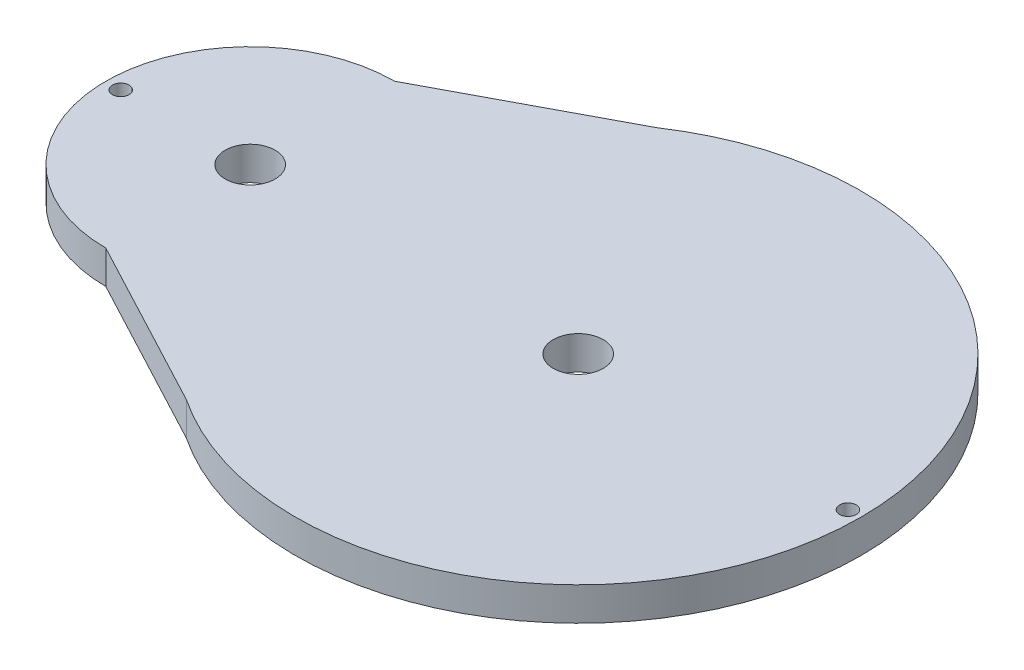
ISO-10303-21;
HEADER;
FILE_DESCRIPTION(('STEP AP214'),'2;1');
FILE_NAME('part.step','',(''),(''),'','','');
FILE_SCHEMA(('AUTOMOTIVE_DESIGN { 1 0 10303 214 1 1 1 1 }'));
ENDSEC;
DATA;
#1=APPLICATION_CONTEXT('core data for automotive mechanical design processes');
#2=APPLICATION_PROTOCOL_DEFINITION('international standard','automotive_design',2000,#1);
#3=PRODUCT_CONTEXT('',#1,'mechanical');
#4=PRODUCT('Part','Part','',(#3));
#5=PRODUCT_RELATED_PRODUCT_CATEGORY('part','',(#4));
#6=PRODUCT_DEFINITION_FORMATION('','',#4);
#7=PRODUCT_DEFINITION_CONTEXT('part definition',#1,'design');
#8=PRODUCT_DEFINITION('design','',#6,#7);
#9=PRODUCT_DEFINITION_SHAPE('','',#8);
#10=(LENGTH_UNIT() NAMED_UNIT(*) SI_UNIT(.MILLI.,.METRE.));
#11=(NAMED_UNIT(*) PLANE_ANGLE_UNIT() SI_UNIT($,.RADIAN.));
#12=(NAMED_UNIT(*) SI_UNIT($,.STERADIAN.) SOLID_ANGLE_UNIT());
#13=UNCERTAINTY_MEASURE_WITH_UNIT(LENGTH_MEASURE(1.E-05),#10,'distance_accuracy_value','');
#14=(GEOMETRIC_REPRESENTATION_CONTEXT(3) GLOBAL_UNCERTAINTY_ASSIGNED_CONTEXT((#13)) GLOBAL_UNIT_ASSIGNED_CONTEXT((#10,
#11,#12)) REPRESENTATION_CONTEXT('',''));
#15=CARTESIAN_POINT('',(0.,0.,0.));
#16=DIRECTION('',(0.,0.,1.));
#17=DIRECTION('',(1.,0.,0.));
#18=AXIS2_PLACEMENT_3D('',#15,#16,#17);
#19=CARTESIAN_POINT('',(31.9089246812045,6.,-7.07485149033878));
#20=DIRECTION('',(0.,-1.,0.));
#21=DIRECTION('',(0.,0.,-1.));
#22=AXIS2_PLACEMENT_3D('',#19,#20,#21);
#23=CYLINDRICAL_SURFACE('',#22,50.89);
#24=CARTESIAN_POINT('',(31.9089246812045,0.,-7.07485149033878));
#25=DIRECTION('',(0.,1.,0.));
#26=DIRECTION('',(0.,0.,1.));
#27=AXIS2_PLACEMENT_3D('',#24,#25,#26);
#28=CIRCLE('',#27,50.89);
#29=CARTESIAN_POINT('',(3.70624919259435,0.,35.2855214457456));
#30=VERTEX_POINT('',#29);
#31=CARTESIAN_POINT('',(3.70624919259435,0.,-49.4352244264231));
#32=VERTEX_POINT('',#31);
#33=EDGE_CURVE('E109',#30,#32,#28,.T.);
#34=ORIENTED_EDGE('',*,*,#33,.T.);
#35=DIRECTION('',(0.,-1.,0.));
#36=VECTOR('',#35,1.);
#37=CARTESIAN_POINT('',(3.70624919259435,6.,-49.4352244264231));
#38=LINE('',#37,#36);
#39=CARTESIAN_POINT('',(3.70624919259435,6.,-49.4352244264231));
#40=VERTEX_POINT('',#39);
#41=EDGE_CURVE('E11',#40,#32,#38,.T.);
#42=ORIENTED_EDGE('',*,*,#41,.F.);
#43=CARTESIAN_POINT('',(31.9089246812045,6.,-7.07485149033878));
#44=DIRECTION('',(0.,1.,0.));
#45=DIRECTION('',(0.,0.,1.));
#46=AXIS2_PLACEMENT_3D('',#43,#44,#45);
#47=CIRCLE('',#46,50.89);
#48=CARTESIAN_POINT('',(3.70624919259435,6.,35.2855214457456));
#49=VERTEX_POINT('',#48);
#50=EDGE_CURVE('E78',#49,#40,#47,.T.);
#51=ORIENTED_EDGE('',*,*,#50,.F.);
#52=DIRECTION('',(0.,-1.,0.));
#53=VECTOR('',#52,1.);
#54=CARTESIAN_POINT('',(3.70624919259435,6.,35.2855214457456));
#55=LINE('',#54,#53);
#56=EDGE_CURVE('E108',#49,#30,#55,.T.);
#57=ORIENTED_EDGE('',*,*,#56,.T.);
#58=EDGE_LOOP('',(#34,#42,#51,#57));
#59=FACE_BOUND('',#58,.T.);
#60=ADVANCED_FACE('F37',(#59),#23,.T.);
#61=CARTESIAN_POINT('',(-19.6475087974022,6.,-37.051191902898));
#62=DIRECTION('',(-0.468486800461283,0.,-0.883470496277917));
#63=DIRECTION('',(-0.883470496277917,0.,0.468486800461283));
#64=AXIS2_PLACEMENT_3D('',#61,#62,#63);
#65=PLANE('',#64);
#66=DIRECTION('',(0.883470496277917,0.,-0.468486800461283));
#67=VECTOR('',#66,1.);
#68=CARTESIAN_POINT('',(-19.6475087974022,0.,-37.051191902898));
#69=LINE('',#68,#67);
#70=CARTESIAN_POINT('',(-27.1460753187955,0.,-33.0748514903388));
#71=VERTEX_POINT('',#70);
#72=EDGE_CURVE('E87',#71,#32,#69,.T.);
#73=ORIENTED_EDGE('',*,*,#72,.F.);
#74=DIRECTION('',(0.,-1.,0.));
#75=VECTOR('',#74,1.);
#76=CARTESIAN_POINT('',(-27.1460753187955,6.,-33.0748514903388));
#77=LINE('',#76,#75);
#78=CARTESIAN_POINT('',(-27.1460753187955,6.,-33.0748514903388));
#79=VERTEX_POINT('',#78);
#80=EDGE_CURVE('E46',#79,#71,#77,.T.);
#81=ORIENTED_EDGE('',*,*,#80,.F.);
#82=DIRECTION('',(0.883470496277917,0.,-0.468486800461283));
#83=VECTOR('',#82,1.);
#84=CARTESIAN_POINT('',(-19.6475087974022,6.,-37.051191902898));
#85=LINE('',#84,#83);
#86=EDGE_CURVE('E85',#79,#40,#85,.T.);
#87=ORIENTED_EDGE('',*,*,#86,.T.);
#88=ORIENTED_EDGE('',*,*,#41,.T.);
#89=EDGE_LOOP('',(#73,#81,#87,#88));
#90=FACE_BOUND('',#89,.T.);
#91=ADVANCED_FACE('F84',(#90),#65,.T.);
#92=CARTESIAN_POINT('',(-27.1460753187955,6.,-7.07485149033878));
#93=DIRECTION('',(0.,-1.,0.));
#94=DIRECTION('',(0.,0.,-1.));
#95=AXIS2_PLACEMENT_3D('',#92,#93,#94);
#96=CYLINDRICAL_SURFACE('',#95,26.);
#97=CARTESIAN_POINT('',(-27.1460753187955,0.,-7.07485149033878));
#98=DIRECTION('',(0.,1.,0.));
#99=DIRECTION('',(0.,0.,1.));
#100=AXIS2_PLACEMENT_3D('',#97,#98,#99);
#101=CIRCLE('',#100,26.);
#102=CARTESIAN_POINT('',(-27.1460753187955,0.,18.9251485096612));
#103=VERTEX_POINT('',#102);
#104=EDGE_CURVE('E113',#103,#71,#101,.F.);
#105=ORIENTED_EDGE('',*,*,#104,.F.);
#106=DIRECTION('',(0.,-1.,0.));
#107=VECTOR('',#106,1.);
#108=CARTESIAN_POINT('',(-27.1460753187955,6.,18.9251485096612));
#109=LINE('',#108,#107);
#110=CARTESIAN_POINT('',(-27.1460753187955,6.,18.9251485096612));
#111=VERTEX_POINT('',#110);
#112=EDGE_CURVE('E70',#111,#103,#109,.T.);
#113=ORIENTED_EDGE('',*,*,#112,.F.);
#114=CARTESIAN_POINT('',(-27.1460753187955,6.,-7.07485149033878));
#115=DIRECTION('',(0.,1.,0.));
#116=DIRECTION('',(0.,0.,1.));
#117=AXIS2_PLACEMENT_3D('',#114,#115,#116);
#118=CIRCLE('',#117,26.);
#119=EDGE_CURVE('E95',#111,#79,#118,.F.);
#120=ORIENTED_EDGE('',*,*,#119,.T.);
#121=ORIENTED_EDGE('',*,*,#80,.T.);
#122=EDGE_LOOP('',(#105,#113,#120,#121));
#123=FACE_BOUND('',#122,.T.);
#124=ADVANCED_FACE('F97',(#123),#96,.T.);
#125=CARTESIAN_POINT('',(-27.1460753187955,6.,-7.07485149033878));
#126=DIRECTION('',(0.,-1.,0.));
#127=DIRECTION('',(0.,0.,-1.));
#128=AXIS2_PLACEMENT_3D('',#125,#126,#127);
#129=CYLINDRICAL_SURFACE('',#128,4.5);
#130=CARTESIAN_POINT('',(-27.1460753187955,6.,-7.07485149033878));
#131=DIRECTION('',(0.,1.,0.));
#132=DIRECTION('',(0.,0.,1.));
#133=AXIS2_PLACEMENT_3D('',#130,#131,#132);
#134=CIRCLE('',#133,4.5);
#135=CARTESIAN_POINT('',(-27.1460753187955,6.,-2.57485149033878));
#136=VERTEX_POINT('',#135);
#137=EDGE_CURVE('E99',#136,#136,#134,.T.);
#138=ORIENTED_EDGE('',*,*,#137,.T.);
#139=EDGE_LOOP('',(#138));
#140=FACE_BOUND('',#139,.T.);
#141=CARTESIAN_POINT('',(-27.1460753187955,0.,-7.07485149033878));
#142=DIRECTION('',(0.,1.,0.));
#143=DIRECTION('',(0.,0.,1.));
#144=AXIS2_PLACEMENT_3D('',#141,#142,#143);
#145=CIRCLE('',#144,4.5);
#146=CARTESIAN_POINT('',(-27.1460753187955,0.,-2.57485149033878));
#147=VERTEX_POINT('',#146);
#148=EDGE_CURVE('E116',#147,#147,#145,.T.);
#149=ORIENTED_EDGE('',*,*,#148,.F.);
#150=EDGE_LOOP('',(#149));
#151=FACE_BOUND('',#150,.T.);
#152=ADVANCED_FACE('F170',(#140,#151),#129,.F.);
#153=CARTESIAN_POINT('',(-13.7910278666367,6.,26.0070640656758));
#154=DIRECTION('',(0.468486800461283,0.,-0.883470496277918));
#155=DIRECTION('',(-0.883470496277918,0.,-0.468486800461283));
#156=AXIS2_PLACEMENT_3D('',#153,#154,#155);
#157=PLANE('',#156);
#158=DIRECTION('',(0.883470496277918,0.,0.468486800461283));
#159=VECTOR('',#158,1.);
#160=CARTESIAN_POINT('',(-13.7910278666367,0.,26.0070640656758));
#161=LINE('',#160,#159);
#162=EDGE_CURVE('E73',#103,#30,#161,.T.);
#163=ORIENTED_EDGE('',*,*,#162,.T.);
#164=ORIENTED_EDGE('',*,*,#56,.F.);
#165=DIRECTION('',(0.883470496277918,0.,0.468486800461283));
#166=VECTOR('',#165,1.);
#167=CARTESIAN_POINT('',(-13.7910278666367,6.,26.0070640656758));
#168=LINE('',#167,#166);
#169=EDGE_CURVE('E55',#111,#49,#168,.T.);
#170=ORIENTED_EDGE('',*,*,#169,.F.);
#171=ORIENTED_EDGE('',*,*,#112,.T.);
#172=EDGE_LOOP('',(#163,#164,#170,#171));
#173=FACE_BOUND('',#172,.T.);
#174=ADVANCED_FACE('F153',(#173),#157,.F.);
#175=CARTESIAN_POINT('',(31.9089246812045,6.,-7.07485149033878));
#176=DIRECTION('',(0.,-1.,0.));
#177=DIRECTION('',(0.,0.,-1.));
#178=AXIS2_PLACEMENT_3D('',#175,#176,#177);
#179=CYLINDRICAL_SURFACE('',#178,4.5);
#180=CARTESIAN_POINT('',(31.9089246812045,6.,-7.07485149033878));
#181=DIRECTION('',(0.,1.,0.));
#182=DIRECTION('',(0.,0.,1.));
#183=AXIS2_PLACEMENT_3D('',#180,#181,#182);
#184=CIRCLE('',#183,4.5);
#185=CARTESIAN_POINT('',(31.9089246812045,6.,-2.57485149033877));
#186=VERTEX_POINT('',#185);
#187=EDGE_CURVE('E105',#186,#186,#184,.T.);
#188=ORIENTED_EDGE('',*,*,#187,.T.);
#189=EDGE_LOOP('',(#188));
#190=FACE_BOUND('',#189,.T.);
#191=CARTESIAN_POINT('',(31.9089246812045,0.,-7.07485149033878));
#192=DIRECTION('',(0.,1.,0.));
#193=DIRECTION('',(0.,0.,1.));
#194=AXIS2_PLACEMENT_3D('',#191,#192,#193);
#195=CIRCLE('',#194,4.5);
#196=CARTESIAN_POINT('',(31.9089246812045,0.,-2.57485149033877));
#197=VERTEX_POINT('',#196);
#198=EDGE_CURVE('E119',#197,#197,#195,.T.);
#199=ORIENTED_EDGE('',*,*,#198,.F.);
#200=EDGE_LOOP('',(#199));
#201=FACE_BOUND('',#200,.T.);
#202=ADVANCED_FACE('F143',(#190,#201),#179,.F.);
#203=CARTESIAN_POINT('',(0.,6.,0.));
#204=DIRECTION('',(0.,1.,0.));
#205=DIRECTION('',(0.,0.,1.));
#206=AXIS2_PLACEMENT_3D('',#203,#204,#205);
#207=PLANE('',#206);
#208=CARTESIAN_POINT('',(-50.4460753187955,6.,-7.07485149033878));
#209=DIRECTION('',(0.,1.,0.));
#210=DIRECTION('',(0.,0.,1.));
#211=AXIS2_PLACEMENT_3D('',#208,#209,#210);
#212=CIRCLE('',#211,1.5);
#213=CARTESIAN_POINT('',(-50.4460753187955,6.,-5.57485149033877));
#214=VERTEX_POINT('',#213);
#215=EDGE_CURVE('E125',#214,#214,#212,.T.);
#216=ORIENTED_EDGE('',*,*,#215,.F.);
#217=EDGE_LOOP('',(#216));
#218=FACE_BOUND('',#217,.T.);
#219=CARTESIAN_POINT('',(80.4589246812045,6.,-7.07485149033878));
#220=DIRECTION('',(0.,1.,0.));
#221=DIRECTION('',(0.,0.,1.));
#222=AXIS2_PLACEMENT_3D('',#219,#220,#221);
#223=CIRCLE('',#222,1.5);
#224=CARTESIAN_POINT('',(80.4589246812045,6.,-5.57485149033878));
#225=VERTEX_POINT('',#224);
#226=EDGE_CURVE('E130',#225,#225,#223,.T.);
#227=ORIENTED_EDGE('',*,*,#226,.F.);
#228=EDGE_LOOP('',(#227));
#229=FACE_BOUND('',#228,.T.);
#230=ORIENTED_EDGE('',*,*,#50,.T.);
#231=ORIENTED_EDGE('',*,*,#86,.F.);
#232=ORIENTED_EDGE('',*,*,#119,.F.);
#233=ORIENTED_EDGE('',*,*,#169,.T.);
#234=EDGE_LOOP('',(#230,#231,#232,#233));
#235=FACE_BOUND('',#234,.T.);
#236=ORIENTED_EDGE('',*,*,#137,.F.);
#237=EDGE_LOOP('',(#236));
#238=FACE_BOUND('',#237,.T.);
#239=ORIENTED_EDGE('',*,*,#187,.F.);
#240=EDGE_LOOP('',(#239));
#241=FACE_BOUND('',#240,.T.);
#242=ADVANCED_FACE('F93',(#218,#229,#235,#238,#241),#207,.T.);
#243=CARTESIAN_POINT('',(0.,0.,0.));
#244=DIRECTION('',(0.,1.,0.));
#245=DIRECTION('',(0.,0.,1.));
#246=AXIS2_PLACEMENT_3D('',#243,#244,#245);
#247=PLANE('',#246);
#248=CARTESIAN_POINT('',(-50.4460753187955,0.,-7.07485149033878));
#249=DIRECTION('',(0.,1.,0.));
#250=DIRECTION('',(0.,0.,1.));
#251=AXIS2_PLACEMENT_3D('',#248,#249,#250);
#252=CIRCLE('',#251,1.5);
#253=CARTESIAN_POINT('',(-50.4460753187955,0.,-5.57485149033877));
#254=VERTEX_POINT('',#253);
#255=EDGE_CURVE('E40',#254,#254,#252,.T.);
#256=ORIENTED_EDGE('',*,*,#255,.T.);
#257=EDGE_LOOP('',(#256));
#258=FACE_BOUND('',#257,.T.);
#259=CARTESIAN_POINT('',(80.4589246812045,0.,-7.07485149033878));
#260=DIRECTION('',(0.,1.,0.));
#261=DIRECTION('',(0.,0.,1.));
#262=AXIS2_PLACEMENT_3D('',#259,#260,#261);
#263=CIRCLE('',#262,1.5);
#264=CARTESIAN_POINT('',(80.4589246812045,0.,-5.57485149033878));
#265=VERTEX_POINT('',#264);
#266=EDGE_CURVE('E123',#265,#265,#263,.T.);
#267=ORIENTED_EDGE('',*,*,#266,.T.);
#268=EDGE_LOOP('',(#267));
#269=FACE_BOUND('',#268,.T.);
#270=ORIENTED_EDGE('',*,*,#33,.F.);
#271=ORIENTED_EDGE('',*,*,#162,.F.);
#272=ORIENTED_EDGE('',*,*,#104,.T.);
#273=ORIENTED_EDGE('',*,*,#72,.T.);
#274=EDGE_LOOP('',(#270,#271,#272,#273));
#275=FACE_BOUND('',#274,.T.);
#276=ORIENTED_EDGE('',*,*,#148,.T.);
#277=EDGE_LOOP('',(#276));
#278=FACE_BOUND('',#277,.T.);
#279=ORIENTED_EDGE('',*,*,#198,.T.);
#280=EDGE_LOOP('',(#279));
#281=FACE_BOUND('',#280,.T.);
#282=ADVANCED_FACE('F142',(#258,#269,#275,#278,#281),#247,.F.);
#283=CARTESIAN_POINT('',(80.4589246812045,-4.,-7.07485149033878));
#284=DIRECTION('',(0.,1.,0.));
#285=DIRECTION('',(0.,0.,1.));
#286=AXIS2_PLACEMENT_3D('',#283,#284,#285);
#287=CYLINDRICAL_SURFACE('',#286,1.5);
#288=ORIENTED_EDGE('',*,*,#226,.T.);
#289=EDGE_LOOP('',(#288));
#290=FACE_BOUND('',#289,.T.);
#291=ORIENTED_EDGE('',*,*,#266,.F.);
#292=EDGE_LOOP('',(#291));
#293=FACE_BOUND('',#292,.T.);
#294=ADVANCED_FACE('F138',(#290,#293),#287,.F.);
#295=CARTESIAN_POINT('',(-50.4460753187955,-4.,-7.07485149033878));
#296=DIRECTION('',(0.,1.,0.));
#297=DIRECTION('',(0.,0.,1.));
#298=AXIS2_PLACEMENT_3D('',#295,#296,#297);
#299=CYLINDRICAL_SURFACE('',#298,1.5);
#300=ORIENTED_EDGE('',*,*,#215,.T.);
#301=EDGE_LOOP('',(#300));
#302=FACE_BOUND('',#301,.T.);
#303=ORIENTED_EDGE('',*,*,#255,.F.);
#304=EDGE_LOOP('',(#303));
#305=FACE_BOUND('',#304,.T.);
#306=ADVANCED_FACE('F239',(#302,#305),#299,.F.);
#307=CLOSED_SHELL('',(#60,#91,#124,#152,#174,#202,#242,#282,#294,#306));
#308=MANIFOLD_SOLID_BREP('B2',#307);
#309=ADVANCED_BREP_SHAPE_REPRESENTATION('',(#18,#308),#14);
#310=SHAPE_DEFINITION_REPRESENTATION(#9,#309);
ENDSEC;
END-ISO-10303-21;
